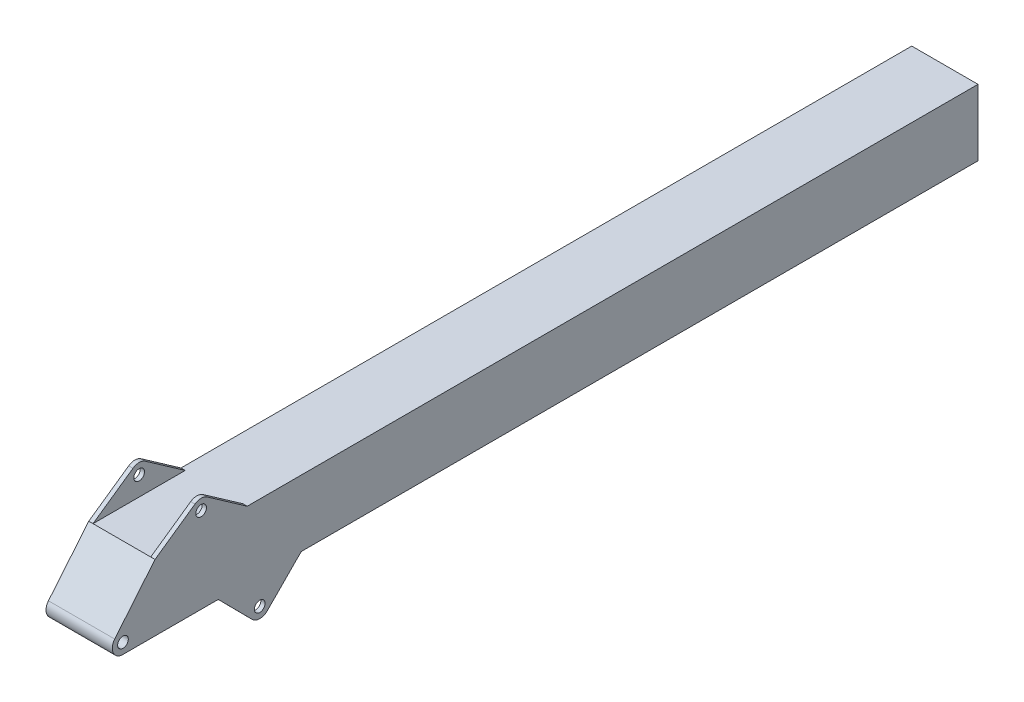
ISO-10303-21;
HEADER;
FILE_DESCRIPTION(('STEP AP214'),'2;1');
FILE_NAME('part.step','',(''),(''),'','','');
FILE_SCHEMA(('AUTOMOTIVE_DESIGN { 1 0 10303 214 1 1 1 1 }'));
ENDSEC;
DATA;
#1=APPLICATION_CONTEXT('core data for automotive mechanical design processes');
#2=APPLICATION_PROTOCOL_DEFINITION('international standard','automotive_design',2000,#1);
#3=PRODUCT_CONTEXT('',#1,'mechanical');
#4=PRODUCT('Part','Part','',(#3));
#5=PRODUCT_RELATED_PRODUCT_CATEGORY('part','',(#4));
#6=PRODUCT_DEFINITION_FORMATION('','',#4);
#7=PRODUCT_DEFINITION_CONTEXT('part definition',#1,'design');
#8=PRODUCT_DEFINITION('design','',#6,#7);
#9=PRODUCT_DEFINITION_SHAPE('','',#8);
#10=(LENGTH_UNIT() NAMED_UNIT(*) SI_UNIT(.MILLI.,.METRE.));
#11=(NAMED_UNIT(*) PLANE_ANGLE_UNIT() SI_UNIT($,.RADIAN.));
#12=(NAMED_UNIT(*) SI_UNIT($,.STERADIAN.) SOLID_ANGLE_UNIT());
#13=UNCERTAINTY_MEASURE_WITH_UNIT(LENGTH_MEASURE(1.E-05),#10,'distance_accuracy_value','');
#14=(GEOMETRIC_REPRESENTATION_CONTEXT(3) GLOBAL_UNCERTAINTY_ASSIGNED_CONTEXT((#13)) GLOBAL_UNIT_ASSIGNED_CONTEXT((#10,
#11,#12)) REPRESENTATION_CONTEXT('',''));
#15=CARTESIAN_POINT('',(0.,0.,0.));
#16=DIRECTION('',(0.,0.,1.));
#17=DIRECTION('',(1.,0.,0.));
#18=AXIS2_PLACEMENT_3D('',#15,#16,#17);
#19=CARTESIAN_POINT('',(-310.,310.,1850.));
#20=DIRECTION('',(0.,1.,0.));
#21=DIRECTION('',(0.,0.,1.));
#22=AXIS2_PLACEMENT_3D('',#19,#20,#21);
#23=PLANE('',#22);
#24=DIRECTION('',(-1.,0.,0.));
#25=VECTOR('',#24,1.);
#26=CARTESIAN_POINT('',(-290.,310.000000000001,1418.58867922431));
#27=LINE('',#26,#25);
#28=CARTESIAN_POINT('',(-290.,310.,1418.58867922431));
#29=VERTEX_POINT('',#28);
#30=CARTESIAN_POINT('',(-310.,310.,1418.58867922431));
#31=VERTEX_POINT('',#30);
#32=EDGE_CURVE('E53',#29,#31,#27,.T.);
#33=ORIENTED_EDGE('',*,*,#32,.F.);
#34=DIRECTION('',(0.,0.,-1.));
#35=VECTOR('',#34,1.);
#36=CARTESIAN_POINT('',(-290.,310.,1850.));
#37=LINE('',#36,#35);
#38=CARTESIAN_POINT('',(-290.,310.,1850.));
#39=VERTEX_POINT('',#38);
#40=EDGE_CURVE('E57',#39,#29,#37,.T.);
#41=ORIENTED_EDGE('',*,*,#40,.F.);
#42=DIRECTION('',(1.,0.,0.));
#43=VECTOR('',#42,1.);
#44=CARTESIAN_POINT('',(-310.,310.,1850.));
#45=LINE('',#44,#43);
#46=CARTESIAN_POINT('',(-20.,310.,1850.));
#47=VERTEX_POINT('',#46);
#48=EDGE_CURVE('E392',#39,#47,#45,.T.);
#49=ORIENTED_EDGE('',*,*,#48,.T.);
#50=DIRECTION('',(0.,0.,-1.));
#51=VECTOR('',#50,1.);
#52=CARTESIAN_POINT('',(-20.,310.,1850.));
#53=LINE('',#52,#51);
#54=CARTESIAN_POINT('',(-20.,310.000000000001,1418.58867922431));
#55=VERTEX_POINT('',#54);
#56=EDGE_CURVE('E278',#47,#55,#53,.T.);
#57=ORIENTED_EDGE('',*,*,#56,.T.);
#58=DIRECTION('',(1.,0.,0.));
#59=VECTOR('',#58,1.);
#60=CARTESIAN_POINT('',(-20.,310.000000000001,1418.58867922431));
#61=LINE('',#60,#59);
#62=CARTESIAN_POINT('',(0.,310.,1418.58867922431));
#63=VERTEX_POINT('',#62);
#64=EDGE_CURVE('E291',#55,#63,#61,.T.);
#65=ORIENTED_EDGE('',*,*,#64,.T.);
#66=DIRECTION('',(0.,0.,1.));
#67=VECTOR('',#66,1.);
#68=CARTESIAN_POINT('',(0.,310.,1850.));
#69=LINE('',#68,#67);
#70=CARTESIAN_POINT('',(0.,310.,-2000.));
#71=VERTEX_POINT('',#70);
#72=EDGE_CURVE('E374',#71,#63,#69,.T.);
#73=ORIENTED_EDGE('',*,*,#72,.F.);
#74=DIRECTION('',(1.,0.,0.));
#75=VECTOR('',#74,1.);
#76=CARTESIAN_POINT('',(-310.,310.,-2000.));
#77=LINE('',#76,#75);
#78=CARTESIAN_POINT('',(-310.,310.,-2000.));
#79=VERTEX_POINT('',#78);
#80=EDGE_CURVE('E11',#79,#71,#77,.T.);
#81=ORIENTED_EDGE('',*,*,#80,.F.);
#82=DIRECTION('',(0.,0.,1.));
#83=VECTOR('',#82,1.);
#84=CARTESIAN_POINT('',(-310.,310.,1850.));
#85=LINE('',#84,#83);
#86=EDGE_CURVE('E377',#79,#31,#85,.T.);
#87=ORIENTED_EDGE('',*,*,#86,.T.);
#88=EDGE_LOOP('',(#33,#41,#49,#57,#65,#73,#81,#87));
#89=FACE_BOUND('',#88,.T.);
#90=ADVANCED_FACE('F37',(#89),#23,.T.);
#91=CARTESIAN_POINT('',(-310.,4.19803081186387E-13,-2000.));
#92=DIRECTION('',(0.,-1.,0.));
#93=DIRECTION('',(0.,0.,-1.));
#94=AXIS2_PLACEMENT_3D('',#91,#92,#93);
#95=PLANE('',#94);
#96=DIRECTION('',(0.,0.,-1.));
#97=VECTOR('',#96,1.);
#98=CARTESIAN_POINT('',(-310.,4.19803081186387E-13,-2000.));
#99=LINE('',#98,#97);
#100=CARTESIAN_POINT('',(-310.,-3.15719672627779E-13,2000.));
#101=VERTEX_POINT('',#100);
#102=CARTESIAN_POINT('',(-310.,-2.33703163939663E-13,1553.96888396555));
#103=VERTEX_POINT('',#102);
#104=EDGE_CURVE('E387',#101,#103,#99,.T.);
#105=ORIENTED_EDGE('',*,*,#104,.T.);
#106=DIRECTION('',(-1.,0.,0.));
#107=VECTOR('',#106,1.);
#108=CARTESIAN_POINT('',(-290.,-2.66824240972082E-13,1553.96888396555));
#109=LINE('',#108,#107);
#110=CARTESIAN_POINT('',(-290.,-2.33703163939663E-13,1553.96888396555));
#111=VERTEX_POINT('',#110);
#112=EDGE_CURVE('E253',#111,#103,#109,.T.);
#113=ORIENTED_EDGE('',*,*,#112,.F.);
#114=DIRECTION('',(0.,0.,1.));
#115=VECTOR('',#114,1.);
#116=CARTESIAN_POINT('',(-290.,-2.66824240972082E-13,1553.96888396555));
#117=LINE('',#116,#115);
#118=CARTESIAN_POINT('',(-290.,-1.62368900095361E-13,1166.03111603445));
#119=VERTEX_POINT('',#118);
#120=EDGE_CURVE('E244',#119,#111,#117,.T.);
#121=ORIENTED_EDGE('',*,*,#120,.F.);
#122=DIRECTION('',(-1.,0.,0.));
#123=VECTOR('',#122,1.);
#124=CARTESIAN_POINT('',(-290.,-2.66824240972082E-13,1166.03111603445));
#125=LINE('',#124,#123);
#126=CARTESIAN_POINT('',(-310.,-2.66824240972082E-13,1166.03111603445));
#127=VERTEX_POINT('',#126);
#128=EDGE_CURVE('E267',#119,#127,#125,.T.);
#129=ORIENTED_EDGE('',*,*,#128,.T.);
#130=CARTESIAN_POINT('',(-310.,4.19803081186387E-13,-2000.));
#131=VERTEX_POINT('',#130);
#132=EDGE_CURVE('E386',#127,#131,#99,.T.);
#133=ORIENTED_EDGE('',*,*,#132,.T.);
#134=DIRECTION('',(1.,0.,0.));
#135=VECTOR('',#134,1.);
#136=CARTESIAN_POINT('',(-310.,4.19803081186387E-13,-2000.));
#137=LINE('',#136,#135);
#138=CARTESIAN_POINT('',(0.,4.19803081186387E-13,-2000.));
#139=VERTEX_POINT('',#138);
#140=EDGE_CURVE('E45',#131,#139,#137,.T.);
#141=ORIENTED_EDGE('',*,*,#140,.T.);
#142=DIRECTION('',(0.,0.,-1.));
#143=VECTOR('',#142,1.);
#144=CARTESIAN_POINT('',(0.,4.19803081186387E-13,-2000.));
#145=LINE('',#144,#143);
#146=CARTESIAN_POINT('',(0.,-1.62368900095361E-13,1166.03111603445));
#147=VERTEX_POINT('',#146);
#148=EDGE_CURVE('E401',#147,#139,#145,.T.);
#149=ORIENTED_EDGE('',*,*,#148,.F.);
#150=DIRECTION('',(1.,0.,0.));
#151=VECTOR('',#150,1.);
#152=CARTESIAN_POINT('',(-20.,-2.66824240972082E-13,1166.03111603445));
#153=LINE('',#152,#151);
#154=CARTESIAN_POINT('',(-20.,-2.66824240972082E-13,1166.03111603445));
#155=VERTEX_POINT('',#154);
#156=EDGE_CURVE('E337',#155,#147,#153,.T.);
#157=ORIENTED_EDGE('',*,*,#156,.F.);
#158=DIRECTION('',(0.,0.,1.));
#159=VECTOR('',#158,1.);
#160=CARTESIAN_POINT('',(-20.,-2.66824240972082E-13,1553.96888396555));
#161=LINE('',#160,#159);
#162=CARTESIAN_POINT('',(-20.,-2.66824240972082E-13,1553.96888396555));
#163=VERTEX_POINT('',#162);
#164=EDGE_CURVE('E323',#155,#163,#161,.T.);
#165=ORIENTED_EDGE('',*,*,#164,.T.);
#166=DIRECTION('',(1.,0.,0.));
#167=VECTOR('',#166,1.);
#168=CARTESIAN_POINT('',(-20.,-2.66824240972082E-13,1553.96888396555));
#169=LINE('',#168,#167);
#170=CARTESIAN_POINT('',(0.,-2.66824240972082E-13,1553.96888396555));
#171=VERTEX_POINT('',#170);
#172=EDGE_CURVE('E333',#163,#171,#169,.T.);
#173=ORIENTED_EDGE('',*,*,#172,.T.);
#174=CARTESIAN_POINT('',(0.,-3.15719672627779E-13,2000.));
#175=VERTEX_POINT('',#174);
#176=EDGE_CURVE('E402',#175,#171,#145,.T.);
#177=ORIENTED_EDGE('',*,*,#176,.F.);
#178=DIRECTION('',(1.,0.,0.));
#179=VECTOR('',#178,1.);
#180=CARTESIAN_POINT('',(-310.,-3.15719672627779E-13,2000.));
#181=LINE('',#180,#179);
#182=EDGE_CURVE('E409',#101,#175,#181,.T.);
#183=ORIENTED_EDGE('',*,*,#182,.F.);
#184=EDGE_LOOP('',(#105,#113,#121,#129,#133,#141,#149,#157,#165,#173,#177,#183));
#185=FACE_BOUND('',#184,.T.);
#186=ADVANCED_FACE('F458',(#185),#95,.T.);
#187=CARTESIAN_POINT('',(-310.,20.0000000000004,-2000.));
#188=DIRECTION('',(0.,-1.,0.));
#189=DIRECTION('',(0.,0.,-1.));
#190=AXIS2_PLACEMENT_3D('',#187,#188,#189);
#191=PLANE('',#190);
#192=DIRECTION('',(-1.,0.,0.));
#193=VECTOR('',#192,1.);
#194=CARTESIAN_POINT('',(-290.,20.0000000000004,1840.58238892007));
#195=LINE('',#194,#193);
#196=CARTESIAN_POINT('',(-20.,20.0000000000004,1840.58238892007));
#197=VERTEX_POINT('',#196);
#198=CARTESIAN_POINT('',(-290.,20.0000000000004,1840.58238892007));
#199=VERTEX_POINT('',#198);
#200=EDGE_CURVE('E343',#197,#199,#195,.T.);
#201=ORIENTED_EDGE('',*,*,#200,.F.);
#202=DIRECTION('',(0.,0.,-1.));
#203=VECTOR('',#202,1.);
#204=CARTESIAN_POINT('',(-20.,20.0000000000004,-2000.));
#205=LINE('',#204,#203);
#206=CARTESIAN_POINT('',(-20.,20.0000000000004,-2000.));
#207=VERTEX_POINT('',#206);
#208=EDGE_CURVE('E351',#197,#207,#205,.T.);
#209=ORIENTED_EDGE('',*,*,#208,.T.);
#210=DIRECTION('',(1.,0.,0.));
#211=VECTOR('',#210,1.);
#212=CARTESIAN_POINT('',(-310.,20.0000000000004,-2000.));
#213=LINE('',#212,#211);
#214=CARTESIAN_POINT('',(-290.,20.0000000000004,-2000.));
#215=VERTEX_POINT('',#214);
#216=EDGE_CURVE('E359',#215,#207,#213,.T.);
#217=ORIENTED_EDGE('',*,*,#216,.F.);
#218=DIRECTION('',(0.,0.,-1.));
#219=VECTOR('',#218,1.);
#220=CARTESIAN_POINT('',(-290.,20.0000000000004,-2000.));
#221=LINE('',#220,#219);
#222=EDGE_CURVE('E355',#199,#215,#221,.T.);
#223=ORIENTED_EDGE('',*,*,#222,.F.);
#224=EDGE_LOOP('',(#201,#209,#217,#223));
#225=FACE_BOUND('',#224,.T.);
#226=ADVANCED_FACE('F462',(#225),#191,.F.);
#227=CARTESIAN_POINT('',(-290.,49.9999999999999,2000.));
#228=DIRECTION('',(-1.,0.,0.));
#229=DIRECTION('',(0.,0.,1.));
#230=AXIS2_PLACEMENT_3D('',#227,#228,#229);
#231=PLANE('',#230);
#232=DIRECTION('',(0.,1.,0.));
#233=VECTOR('',#232,1.);
#234=CARTESIAN_POINT('',(-290.,20.0000000000004,1840.58238892007));
#235=LINE('',#234,#233);
#236=CARTESIAN_POINT('',(-290.,290.,1840.58238892007));
#237=VERTEX_POINT('',#236);
#238=EDGE_CURVE('E336',#199,#237,#235,.T.);
#239=ORIENTED_EDGE('',*,*,#238,.F.);
#240=ORIENTED_EDGE('',*,*,#222,.T.);
#241=DIRECTION('',(0.,1.,0.));
#242=VECTOR('',#241,1.);
#243=CARTESIAN_POINT('',(-290.,310.,-2000.));
#244=LINE('',#243,#242);
#245=CARTESIAN_POINT('',(-290.,290.,-2000.));
#246=VERTEX_POINT('',#245);
#247=EDGE_CURVE('E360',#215,#246,#244,.T.);
#248=ORIENTED_EDGE('',*,*,#247,.T.);
#249=DIRECTION('',(0.,0.,1.));
#250=VECTOR('',#249,1.);
#251=CARTESIAN_POINT('',(-290.,290.,1850.));
#252=LINE('',#251,#250);
#253=EDGE_CURVE('E352',#246,#237,#252,.T.);
#254=ORIENTED_EDGE('',*,*,#253,.T.);
#255=EDGE_LOOP('',(#239,#240,#248,#254));
#256=FACE_BOUND('',#255,.T.);
#257=ADVANCED_FACE('F468',(#256),#231,.F.);
#258=CARTESIAN_POINT('',(-20.,49.9999999999999,2000.));
#259=DIRECTION('',(-1.,0.,0.));
#260=DIRECTION('',(0.,0.,1.));
#261=AXIS2_PLACEMENT_3D('',#258,#259,#260);
#262=PLANE('',#261);
#263=ORIENTED_EDGE('',*,*,#208,.F.);
#264=DIRECTION('',(0.,-1.,0.));
#265=VECTOR('',#264,1.);
#266=CARTESIAN_POINT('',(-20.,20.0000000000004,1840.58238892007));
#267=LINE('',#266,#265);
#268=CARTESIAN_POINT('',(-20.,290.,1840.58238892007));
#269=VERTEX_POINT('',#268);
#270=EDGE_CURVE('E346',#269,#197,#267,.T.);
#271=ORIENTED_EDGE('',*,*,#270,.F.);
#272=DIRECTION('',(0.,0.,1.));
#273=VECTOR('',#272,1.);
#274=CARTESIAN_POINT('',(-20.,290.,1850.));
#275=LINE('',#274,#273);
#276=CARTESIAN_POINT('',(-20.,290.,-2000.));
#277=VERTEX_POINT('',#276);
#278=EDGE_CURVE('E345',#277,#269,#275,.T.);
#279=ORIENTED_EDGE('',*,*,#278,.F.);
#280=DIRECTION('',(0.,1.,0.));
#281=VECTOR('',#280,1.);
#282=CARTESIAN_POINT('',(-20.,310.,-2000.));
#283=LINE('',#282,#281);
#284=EDGE_CURVE('E356',#207,#277,#283,.T.);
#285=ORIENTED_EDGE('',*,*,#284,.F.);
#286=EDGE_LOOP('',(#263,#271,#279,#285));
#287=FACE_BOUND('',#286,.T.);
#288=ADVANCED_FACE('F493',(#287),#262,.T.);
#289=CARTESIAN_POINT('',(-310.,310.,-2000.));
#290=DIRECTION('',(0.,0.,-1.));
#291=DIRECTION('',(-1.,0.,0.));
#292=AXIS2_PLACEMENT_3D('',#289,#290,#291);
#293=PLANE('',#292);
#294=DIRECTION('',(0.,1.,0.));
#295=VECTOR('',#294,1.);
#296=CARTESIAN_POINT('',(0.,310.,-2000.));
#297=LINE('',#296,#295);
#298=EDGE_CURVE('E380',#139,#71,#297,.T.);
#299=ORIENTED_EDGE('',*,*,#298,.F.);
#300=ORIENTED_EDGE('',*,*,#140,.F.);
#301=DIRECTION('',(0.,1.,0.));
#302=VECTOR('',#301,1.);
#303=CARTESIAN_POINT('',(-310.,310.,-2000.));
#304=LINE('',#303,#302);
#305=EDGE_CURVE('E389',#131,#79,#304,.T.);
#306=ORIENTED_EDGE('',*,*,#305,.T.);
#307=ORIENTED_EDGE('',*,*,#80,.T.);
#308=EDGE_LOOP('',(#299,#300,#306,#307));
#309=FACE_BOUND('',#308,.T.);
#310=ORIENTED_EDGE('',*,*,#216,.T.);
#311=ORIENTED_EDGE('',*,*,#284,.T.);
#312=DIRECTION('',(1.,0.,0.));
#313=VECTOR('',#312,1.);
#314=CARTESIAN_POINT('',(-310.,290.,-2000.));
#315=LINE('',#314,#313);
#316=EDGE_CURVE('E363',#246,#277,#315,.T.);
#317=ORIENTED_EDGE('',*,*,#316,.F.);
#318=ORIENTED_EDGE('',*,*,#247,.F.);
#319=EDGE_LOOP('',(#310,#311,#317,#318));
#320=FACE_BOUND('',#319,.T.);
#321=ADVANCED_FACE('F438',(#309,#320),#293,.T.);
#322=CARTESIAN_POINT('',(-310.,49.9999999999999,2000.));
#323=DIRECTION('',(1.,0.,0.));
#324=DIRECTION('',(0.,0.,-1.));
#325=AXIS2_PLACEMENT_3D('',#322,#323,#324);
#326=CYLINDRICAL_SURFACE('',#325,50.0000000000001);
#327=CARTESIAN_POINT('',(0.,49.9999999999999,2000.));
#328=DIRECTION('',(1.,0.,0.));
#329=DIRECTION('',(0.,0.,1.));
#330=AXIS2_PLACEMENT_3D('',#327,#328,#329);
#331=CIRCLE('',#330,50.0000000000001);
#332=CARTESIAN_POINT('',(0.,81.851246260181,2038.54216018431));
#333=VERTEX_POINT('',#332);
#334=EDGE_CURVE('E398',#333,#175,#331,.T.);
#335=ORIENTED_EDGE('',*,*,#334,.F.);
#336=DIRECTION('',(1.,0.,0.));
#337=VECTOR('',#336,1.);
#338=CARTESIAN_POINT('',(-310.,81.851246260181,2038.54216018431));
#339=LINE('',#338,#337);
#340=CARTESIAN_POINT('',(-310.,81.851246260181,2038.54216018431));
#341=VERTEX_POINT('',#340);
#342=EDGE_CURVE('E410',#341,#333,#339,.T.);
#343=ORIENTED_EDGE('',*,*,#342,.F.);
#344=CARTESIAN_POINT('',(-310.,49.9999999999999,2000.));
#345=DIRECTION('',(1.,0.,0.));
#346=DIRECTION('',(0.,0.,1.));
#347=AXIS2_PLACEMENT_3D('',#344,#345,#346);
#348=CIRCLE('',#347,50.0000000000001);
#349=EDGE_CURVE('E383',#341,#101,#348,.T.);
#350=ORIENTED_EDGE('',*,*,#349,.T.);
#351=ORIENTED_EDGE('',*,*,#182,.T.);
#352=EDGE_LOOP('',(#335,#343,#350,#351));
#353=FACE_BOUND('',#352,.T.);
#354=ADVANCED_FACE('F474',(#353),#326,.T.);
#355=CARTESIAN_POINT('',(-310.,81.8512462601809,2038.54216018431));
#356=DIRECTION('',(0.,0.63702492520362,0.770843203686277));
#357=DIRECTION('',(0.,-0.770843203686277,0.63702492520362));
#358=AXIS2_PLACEMENT_3D('',#355,#356,#357);
#359=PLANE('',#358);
#360=DIRECTION('',(0.,-0.770843203686277,0.63702492520362));
#361=VECTOR('',#360,1.);
#362=CARTESIAN_POINT('',(0.,81.8512462601809,2038.54216018431));
#363=LINE('',#362,#361);
#364=CARTESIAN_POINT('',(0.,310.,1850.));
#365=VERTEX_POINT('',#364);
#366=EDGE_CURVE('E395',#365,#333,#363,.T.);
#367=ORIENTED_EDGE('',*,*,#366,.F.);
#368=DIRECTION('',(1.,0.,0.));
#369=VECTOR('',#368,1.);
#370=CARTESIAN_POINT('',(-20.,310.,1850.));
#371=LINE('',#370,#369);
#372=EDGE_CURVE('E299',#47,#365,#371,.T.);
#373=ORIENTED_EDGE('',*,*,#372,.F.);
#374=ORIENTED_EDGE('',*,*,#48,.F.);
#375=CARTESIAN_POINT('',(-310.,310.,1850.));
#376=VERTEX_POINT('',#375);
#377=EDGE_CURVE('E40',#376,#39,#45,.T.);
#378=ORIENTED_EDGE('',*,*,#377,.F.);
#379=DIRECTION('',(0.,-0.770843203686277,0.63702492520362));
#380=VECTOR('',#379,1.);
#381=CARTESIAN_POINT('',(-310.,81.8512462601809,2038.54216018431));
#382=LINE('',#381,#380);
#383=EDGE_CURVE('E379',#376,#341,#382,.T.);
#384=ORIENTED_EDGE('',*,*,#383,.T.);
#385=ORIENTED_EDGE('',*,*,#342,.T.);
#386=EDGE_LOOP('',(#367,#373,#374,#378,#384,#385));
#387=FACE_BOUND('',#386,.T.);
#388=ADVANCED_FACE('F424',(#387),#359,.T.);
#389=CARTESIAN_POINT('',(-310.,49.9999999999999,2000.));
#390=DIRECTION('',(-1.,0.,0.));
#391=DIRECTION('',(0.,0.,1.));
#392=AXIS2_PLACEMENT_3D('',#389,#390,#391);
#393=PLANE('',#392);
#394=CARTESIAN_POINT('',(-310.,49.9999999999999,2000.));
#395=DIRECTION('',(1.,0.,0.));
#396=DIRECTION('',(0.,0.,-1.));
#397=AXIS2_PLACEMENT_3D('',#394,#395,#396);
#398=CIRCLE('',#397,25.);
#399=CARTESIAN_POINT('',(-310.,49.9999999999999,1975.));
#400=VERTEX_POINT('',#399);
#401=EDGE_CURVE('E371',#400,#400,#398,.T.);
#402=ORIENTED_EDGE('',*,*,#401,.T.);
#403=EDGE_LOOP('',(#402));
#404=FACE_BOUND('',#403,.T.);
#405=ORIENTED_EDGE('',*,*,#86,.F.);
#406=ORIENTED_EDGE('',*,*,#305,.F.);
#407=ORIENTED_EDGE('',*,*,#132,.F.);
#408=DIRECTION('',(0.,0.710959807943813,-0.7032326439298));
#409=VECTOR('',#408,1.);
#410=CARTESIAN_POINT('',(-310.,-2.66824240972082E-13,1166.03111603445));
#411=LINE('',#410,#409);
#412=CARTESIAN_POINT('',(-310.,-160.16163219649,1324.45200960281));
#413=VERTEX_POINT('',#412);
#414=EDGE_CURVE('E256',#413,#127,#411,.T.);
#415=ORIENTED_EDGE('',*,*,#414,.F.);
#416=CARTESIAN_POINT('',(-310.,-125.,1360.));
#417=DIRECTION('',(1.,0.,0.));
#418=DIRECTION('',(0.,0.,1.));
#419=AXIS2_PLACEMENT_3D('',#416,#417,#418);
#420=CIRCLE('',#419,50.0000000000001);
#421=CARTESIAN_POINT('',(-310.,-160.16163219649,1395.54799039719));
#422=VERTEX_POINT('',#421);
#423=EDGE_CURVE('E245',#422,#413,#420,.T.);
#424=ORIENTED_EDGE('',*,*,#423,.F.);
#425=DIRECTION('',(0.,-0.710959807943813,-0.7032326439298));
#426=VECTOR('',#425,1.);
#427=CARTESIAN_POINT('',(-310.,-160.161632196491,1395.54799039719));
#428=LINE('',#427,#426);
#429=EDGE_CURVE('E238',#103,#422,#428,.T.);
#430=ORIENTED_EDGE('',*,*,#429,.F.);
#431=ORIENTED_EDGE('',*,*,#104,.F.);
#432=ORIENTED_EDGE('',*,*,#349,.F.);
#433=ORIENTED_EDGE('',*,*,#383,.F.);
#434=DIRECTION('',(0.,-0.573576436351046,0.819152044288991));
#435=VECTOR('',#434,1.);
#436=CARTESIAN_POINT('',(-310.,310.,1850.));
#437=LINE('',#436,#435);
#438=CARTESIAN_POINT('',(-310.,440.95760221445,1662.97316142971));
#439=VERTEX_POINT('',#438);
#440=EDGE_CURVE('E227',#439,#376,#437,.T.);
#441=ORIENTED_EDGE('',*,*,#440,.F.);
#442=CARTESIAN_POINT('',(-310.,400.,1634.29433961216));
#443=DIRECTION('',(1.,0.,0.));
#444=DIRECTION('',(0.,0.,-1.));
#445=AXIS2_PLACEMENT_3D('',#442,#443,#444);
#446=CIRCLE('',#445,50.);
#447=CARTESIAN_POINT('',(-310.,440.95760221445,1605.6155177946));
#448=VERTEX_POINT('',#447);
#449=EDGE_CURVE('E213',#448,#439,#446,.T.);
#450=ORIENTED_EDGE('',*,*,#449,.F.);
#451=DIRECTION('',(0.,0.573576436351047,0.819152044288991));
#452=VECTOR('',#451,1.);
#453=CARTESIAN_POINT('',(-310.,440.95760221445,1605.6155177946));
#454=LINE('',#453,#452);
#455=EDGE_CURVE('E222',#31,#448,#454,.T.);
#456=ORIENTED_EDGE('',*,*,#455,.F.);
#457=EDGE_LOOP('',(#405,#406,#407,#415,#424,#430,#431,#432,#433,#441,#450,#456));
#458=FACE_BOUND('',#457,.T.);
#459=CARTESIAN_POINT('',(-310.,-125.,1360.));
#460=DIRECTION('',(1.,0.,0.));
#461=DIRECTION('',(0.,0.,-1.));
#462=AXIS2_PLACEMENT_3D('',#459,#460,#461);
#463=CIRCLE('',#462,25.);
#464=CARTESIAN_POINT('',(-310.,-125.,1335.));
#465=VERTEX_POINT('',#464);
#466=EDGE_CURVE('E233',#465,#465,#463,.T.);
#467=ORIENTED_EDGE('',*,*,#466,.T.);
#468=EDGE_LOOP('',(#467));
#469=FACE_BOUND('',#468,.T.);
#470=CARTESIAN_POINT('',(-310.,400.,1634.29433961216));
#471=DIRECTION('',(1.,0.,0.));
#472=DIRECTION('',(0.,0.,-1.));
#473=AXIS2_PLACEMENT_3D('',#470,#471,#472);
#474=CIRCLE('',#473,25.);
#475=CARTESIAN_POINT('',(-310.,400.,1609.29433961216));
#476=VERTEX_POINT('',#475);
#477=EDGE_CURVE('E573',#476,#476,#474,.T.);
#478=ORIENTED_EDGE('',*,*,#477,.T.);
#479=EDGE_LOOP('',(#478));
#480=FACE_BOUND('',#479,.T.);
#481=ADVANCED_FACE('F444',(#404,#458,#469,#480),#393,.T.);
#482=CARTESIAN_POINT('',(0.,49.9999999999999,2000.));
#483=DIRECTION('',(-1.,0.,0.));
#484=DIRECTION('',(0.,0.,1.));
#485=AXIS2_PLACEMENT_3D('',#482,#483,#484);
#486=PLANE('',#485);
#487=CARTESIAN_POINT('',(0.,49.9999999999999,2000.));
#488=DIRECTION('',(1.,0.,0.));
#489=DIRECTION('',(0.,0.,-1.));
#490=AXIS2_PLACEMENT_3D('',#487,#488,#489);
#491=CIRCLE('',#490,25.);
#492=CARTESIAN_POINT('',(0.,49.9999999999999,1975.));
#493=VERTEX_POINT('',#492);
#494=EDGE_CURVE('E365',#493,#493,#491,.T.);
#495=ORIENTED_EDGE('',*,*,#494,.F.);
#496=EDGE_LOOP('',(#495));
#497=FACE_BOUND('',#496,.T.);
#498=ORIENTED_EDGE('',*,*,#72,.T.);
#499=DIRECTION('',(0.,0.573576436351047,0.819152044288991));
#500=VECTOR('',#499,1.);
#501=CARTESIAN_POINT('',(0.,440.95760221445,1605.6155177946));
#502=LINE('',#501,#500);
#503=CARTESIAN_POINT('',(0.,440.95760221445,1605.6155177946));
#504=VERTEX_POINT('',#503);
#505=EDGE_CURVE('E275',#63,#504,#502,.T.);
#506=ORIENTED_EDGE('',*,*,#505,.T.);
#507=CARTESIAN_POINT('',(0.,400.,1634.29433961216));
#508=DIRECTION('',(1.,0.,0.));
#509=DIRECTION('',(0.,0.,-1.));
#510=AXIS2_PLACEMENT_3D('',#507,#508,#509);
#511=CIRCLE('',#510,50.);
#512=CARTESIAN_POINT('',(0.,440.95760221445,1662.97316142971));
#513=VERTEX_POINT('',#512);
#514=EDGE_CURVE('E294',#504,#513,#511,.T.);
#515=ORIENTED_EDGE('',*,*,#514,.T.);
#516=DIRECTION('',(0.,-0.573576436351046,0.819152044288991));
#517=VECTOR('',#516,1.);
#518=CARTESIAN_POINT('',(0.,310.,1850.));
#519=LINE('',#518,#517);
#520=EDGE_CURVE('E282',#513,#365,#519,.T.);
#521=ORIENTED_EDGE('',*,*,#520,.T.);
#522=ORIENTED_EDGE('',*,*,#366,.T.);
#523=ORIENTED_EDGE('',*,*,#334,.T.);
#524=ORIENTED_EDGE('',*,*,#176,.T.);
#525=DIRECTION('',(0.,-0.710959807943813,-0.7032326439298));
#526=VECTOR('',#525,1.);
#527=CARTESIAN_POINT('',(0.,-160.161632196491,1395.54799039719));
#528=LINE('',#527,#526);
#529=CARTESIAN_POINT('',(0.,-160.16163219649,1395.54799039719));
#530=VERTEX_POINT('',#529);
#531=EDGE_CURVE('E311',#171,#530,#528,.T.);
#532=ORIENTED_EDGE('',*,*,#531,.T.);
#533=CARTESIAN_POINT('',(0.,-125.,1360.));
#534=DIRECTION('',(1.,0.,0.));
#535=DIRECTION('',(0.,0.,1.));
#536=AXIS2_PLACEMENT_3D('',#533,#534,#535);
#537=CIRCLE('',#536,50.0000000000001);
#538=CARTESIAN_POINT('',(0.,-160.16163219649,1324.45200960281));
#539=VERTEX_POINT('',#538);
#540=EDGE_CURVE('E329',#530,#539,#537,.T.);
#541=ORIENTED_EDGE('',*,*,#540,.T.);
#542=DIRECTION('',(0.,0.710959807943813,-0.7032326439298));
#543=VECTOR('',#542,1.);
#544=CARTESIAN_POINT('',(0.,-2.66824240972082E-13,1166.03111603445));
#545=LINE('',#544,#543);
#546=EDGE_CURVE('E318',#539,#147,#545,.T.);
#547=ORIENTED_EDGE('',*,*,#546,.T.);
#548=ORIENTED_EDGE('',*,*,#148,.T.);
#549=ORIENTED_EDGE('',*,*,#298,.T.);
#550=EDGE_LOOP('',(#498,#506,#515,#521,#522,#523,#524,#532,#541,#547,#548,#549));
#551=FACE_BOUND('',#550,.T.);
#552=CARTESIAN_POINT('',(0.,-125.,1360.));
#553=DIRECTION('',(1.,0.,0.));
#554=DIRECTION('',(0.,0.,-1.));
#555=AXIS2_PLACEMENT_3D('',#552,#553,#554);
#556=CIRCLE('',#555,25.);
#557=CARTESIAN_POINT('',(0.,-125.,1335.));
#558=VERTEX_POINT('',#557);
#559=EDGE_CURVE('E301',#558,#558,#556,.T.);
#560=ORIENTED_EDGE('',*,*,#559,.F.);
#561=EDGE_LOOP('',(#560));
#562=FACE_BOUND('',#561,.T.);
#563=CARTESIAN_POINT('',(0.,400.,1634.29433961216));
#564=DIRECTION('',(1.,0.,0.));
#565=DIRECTION('',(0.,0.,-1.));
#566=AXIS2_PLACEMENT_3D('',#563,#564,#565);
#567=CIRCLE('',#566,25.);
#568=CARTESIAN_POINT('',(0.,400.,1609.29433961216));
#569=VERTEX_POINT('',#568);
#570=EDGE_CURVE('E263',#569,#569,#567,.T.);
#571=ORIENTED_EDGE('',*,*,#570,.F.);
#572=EDGE_LOOP('',(#571));
#573=FACE_BOUND('',#572,.T.);
#574=ADVANCED_FACE('F426',(#497,#551,#562,#573),#486,.F.);
#575=CARTESIAN_POINT('',(-310.,49.9999999999999,2000.));
#576=DIRECTION('',(1.,0.,0.));
#577=DIRECTION('',(0.,0.,-1.));
#578=AXIS2_PLACEMENT_3D('',#575,#576,#577);
#579=CYLINDRICAL_SURFACE('',#578,25.);
#580=ORIENTED_EDGE('',*,*,#401,.F.);
#581=EDGE_LOOP('',(#580));
#582=FACE_BOUND('',#581,.T.);
#583=ORIENTED_EDGE('',*,*,#494,.T.);
#584=EDGE_LOOP('',(#583));
#585=FACE_BOUND('',#584,.T.);
#586=ADVANCED_FACE('F486',(#582,#585),#579,.F.);
#587=CARTESIAN_POINT('',(-310.,290.,1850.));
#588=DIRECTION('',(0.,1.,0.));
#589=DIRECTION('',(0.,0.,1.));
#590=AXIS2_PLACEMENT_3D('',#587,#588,#589);
#591=PLANE('',#590);
#592=ORIENTED_EDGE('',*,*,#278,.T.);
#593=DIRECTION('',(1.,0.,0.));
#594=VECTOR('',#593,1.);
#595=CARTESIAN_POINT('',(-310.,290.,1840.58238892007));
#596=LINE('',#595,#594);
#597=EDGE_CURVE('E357',#237,#269,#596,.T.);
#598=ORIENTED_EDGE('',*,*,#597,.F.);
#599=ORIENTED_EDGE('',*,*,#253,.F.);
#600=ORIENTED_EDGE('',*,*,#316,.T.);
#601=EDGE_LOOP('',(#592,#598,#599,#600));
#602=FACE_BOUND('',#601,.T.);
#603=ADVANCED_FACE('F491',(#602),#591,.F.);
#604=CARTESIAN_POINT('',(0.,0.,1840.58238892007));
#605=DIRECTION('',(0.,0.,1.));
#606=DIRECTION('',(1.,0.,0.));
#607=AXIS2_PLACEMENT_3D('',#604,#605,#606);
#608=PLANE('',#607);
#609=ORIENTED_EDGE('',*,*,#200,.T.);
#610=ORIENTED_EDGE('',*,*,#238,.T.);
#611=ORIENTED_EDGE('',*,*,#597,.T.);
#612=ORIENTED_EDGE('',*,*,#270,.T.);
#613=EDGE_LOOP('',(#609,#610,#611,#612));
#614=FACE_BOUND('',#613,.T.);
#615=ADVANCED_FACE('F502',(#614),#608,.F.);
#616=CARTESIAN_POINT('',(-20.,-160.161632196491,1395.54799039719));
#617=DIRECTION('',(0.,-0.7032326439298,0.710959807943813));
#618=DIRECTION('',(0.,-0.710959807943813,-0.7032326439298));
#619=AXIS2_PLACEMENT_3D('',#616,#617,#618);
#620=PLANE('',#619);
#621=ORIENTED_EDGE('',*,*,#531,.F.);
#622=ORIENTED_EDGE('',*,*,#172,.F.);
#623=DIRECTION('',(0.,-0.710959807943813,-0.7032326439298));
#624=VECTOR('',#623,1.);
#625=CARTESIAN_POINT('',(-20.,-160.161632196491,1395.54799039719));
#626=LINE('',#625,#624);
#627=CARTESIAN_POINT('',(-20.,-160.16163219649,1395.54799039719));
#628=VERTEX_POINT('',#627);
#629=EDGE_CURVE('E314',#163,#628,#626,.T.);
#630=ORIENTED_EDGE('',*,*,#629,.T.);
#631=DIRECTION('',(1.,0.,0.));
#632=VECTOR('',#631,1.);
#633=CARTESIAN_POINT('',(-20.,-160.16163219649,1395.54799039719));
#634=LINE('',#633,#632);
#635=EDGE_CURVE('E326',#628,#530,#634,.T.);
#636=ORIENTED_EDGE('',*,*,#635,.T.);
#637=EDGE_LOOP('',(#621,#622,#630,#636));
#638=FACE_BOUND('',#637,.T.);
#639=ADVANCED_FACE('F506',(#638),#620,.T.);
#640=CARTESIAN_POINT('',(-20.,-2.66824240972082E-13,1166.03111603445));
#641=DIRECTION('',(0.,-0.7032326439298,-0.710959807943813));
#642=DIRECTION('',(0.,0.710959807943813,-0.7032326439298));
#643=AXIS2_PLACEMENT_3D('',#640,#641,#642);
#644=PLANE('',#643);
#645=ORIENTED_EDGE('',*,*,#546,.F.);
#646=DIRECTION('',(1.,0.,0.));
#647=VECTOR('',#646,1.);
#648=CARTESIAN_POINT('',(-20.,-160.16163219649,1324.45200960281));
#649=LINE('',#648,#647);
#650=CARTESIAN_POINT('',(-20.,-160.16163219649,1324.45200960281));
#651=VERTEX_POINT('',#650);
#652=EDGE_CURVE('E340',#651,#539,#649,.T.);
#653=ORIENTED_EDGE('',*,*,#652,.F.);
#654=DIRECTION('',(0.,0.710959807943813,-0.7032326439298));
#655=VECTOR('',#654,1.);
#656=CARTESIAN_POINT('',(-20.,-2.66824240972082E-13,1166.03111603445));
#657=LINE('',#656,#655);
#658=EDGE_CURVE('E321',#651,#155,#657,.T.);
#659=ORIENTED_EDGE('',*,*,#658,.T.);
#660=ORIENTED_EDGE('',*,*,#156,.T.);
#661=EDGE_LOOP('',(#645,#653,#659,#660));
#662=FACE_BOUND('',#661,.T.);
#663=ADVANCED_FACE('F510',(#662),#644,.T.);
#664=CARTESIAN_POINT('',(-20.,-125.,1360.));
#665=DIRECTION('',(1.,0.,0.));
#666=DIRECTION('',(0.,0.,-1.));
#667=AXIS2_PLACEMENT_3D('',#664,#665,#666);
#668=CYLINDRICAL_SURFACE('',#667,50.0000000000001);
#669=ORIENTED_EDGE('',*,*,#540,.F.);
#670=ORIENTED_EDGE('',*,*,#635,.F.);
#671=CARTESIAN_POINT('',(-20.,-125.,1360.));
#672=DIRECTION('',(1.,0.,0.));
#673=DIRECTION('',(0.,0.,1.));
#674=AXIS2_PLACEMENT_3D('',#671,#672,#673);
#675=CIRCLE('',#674,50.0000000000001);
#676=EDGE_CURVE('E317',#628,#651,#675,.T.);
#677=ORIENTED_EDGE('',*,*,#676,.T.);
#678=ORIENTED_EDGE('',*,*,#652,.T.);
#679=EDGE_LOOP('',(#669,#670,#677,#678));
#680=FACE_BOUND('',#679,.T.);
#681=ADVANCED_FACE('F512',(#680),#668,.T.);
#682=CARTESIAN_POINT('',(-20.,-125.,1360.));
#683=DIRECTION('',(-1.,0.,0.));
#684=DIRECTION('',(0.,0.,1.));
#685=AXIS2_PLACEMENT_3D('',#682,#683,#684);
#686=PLANE('',#685);
#687=CARTESIAN_POINT('',(-20.,-125.,1360.));
#688=DIRECTION('',(1.,0.,0.));
#689=DIRECTION('',(0.,0.,-1.));
#690=AXIS2_PLACEMENT_3D('',#687,#688,#689);
#691=CIRCLE('',#690,25.);
#692=CARTESIAN_POINT('',(-20.,-125.,1335.));
#693=VERTEX_POINT('',#692);
#694=EDGE_CURVE('E308',#693,#693,#691,.T.);
#695=ORIENTED_EDGE('',*,*,#694,.T.);
#696=EDGE_LOOP('',(#695));
#697=FACE_BOUND('',#696,.T.);
#698=ORIENTED_EDGE('',*,*,#629,.F.);
#699=ORIENTED_EDGE('',*,*,#164,.F.);
#700=ORIENTED_EDGE('',*,*,#658,.F.);
#701=ORIENTED_EDGE('',*,*,#676,.F.);
#702=EDGE_LOOP('',(#698,#699,#700,#701));
#703=FACE_BOUND('',#702,.T.);
#704=ADVANCED_FACE('F515',(#697,#703),#686,.T.);
#705=CARTESIAN_POINT('',(-20.,-125.,1360.));
#706=DIRECTION('',(1.,0.,0.));
#707=DIRECTION('',(0.,0.,-1.));
#708=AXIS2_PLACEMENT_3D('',#705,#706,#707);
#709=CYLINDRICAL_SURFACE('',#708,25.);
#710=ORIENTED_EDGE('',*,*,#694,.F.);
#711=EDGE_LOOP('',(#710));
#712=FACE_BOUND('',#711,.T.);
#713=ORIENTED_EDGE('',*,*,#559,.T.);
#714=EDGE_LOOP('',(#713));
#715=FACE_BOUND('',#714,.T.);
#716=ADVANCED_FACE('F522',(#712,#715),#709,.F.);
#717=CARTESIAN_POINT('',(-20.,310.,1850.));
#718=DIRECTION('',(0.,0.819152044288991,0.573576436351046));
#719=DIRECTION('',(0.,-0.573576436351046,0.819152044288991));
#720=AXIS2_PLACEMENT_3D('',#717,#718,#719);
#721=PLANE('',#720);
#722=ORIENTED_EDGE('',*,*,#520,.F.);
#723=DIRECTION('',(1.,0.,0.));
#724=VECTOR('',#723,1.);
#725=CARTESIAN_POINT('',(-20.,440.95760221445,1662.97316142971));
#726=LINE('',#725,#724);
#727=CARTESIAN_POINT('',(-20.,440.95760221445,1662.97316142971));
#728=VERTEX_POINT('',#727);
#729=EDGE_CURVE('E302',#728,#513,#726,.T.);
#730=ORIENTED_EDGE('',*,*,#729,.F.);
#731=DIRECTION('',(0.,-0.573576436351046,0.819152044288991));
#732=VECTOR('',#731,1.);
#733=CARTESIAN_POINT('',(-20.,310.,1850.));
#734=LINE('',#733,#732);
#735=EDGE_CURVE('E288',#728,#47,#734,.T.);
#736=ORIENTED_EDGE('',*,*,#735,.T.);
#737=ORIENTED_EDGE('',*,*,#372,.T.);
#738=EDGE_LOOP('',(#722,#730,#736,#737));
#739=FACE_BOUND('',#738,.T.);
#740=ADVANCED_FACE('F423',(#739),#721,.T.);
#741=CARTESIAN_POINT('',(-20.,400.,1634.29433961216));
#742=DIRECTION('',(1.,0.,0.));
#743=DIRECTION('',(0.,0.,-1.));
#744=AXIS2_PLACEMENT_3D('',#741,#742,#743);
#745=CYLINDRICAL_SURFACE('',#744,50.);
#746=ORIENTED_EDGE('',*,*,#514,.F.);
#747=DIRECTION('',(1.,0.,0.));
#748=VECTOR('',#747,1.);
#749=CARTESIAN_POINT('',(-20.,440.95760221445,1605.6155177946));
#750=LINE('',#749,#748);
#751=CARTESIAN_POINT('',(-20.,440.95760221445,1605.6155177946));
#752=VERTEX_POINT('',#751);
#753=EDGE_CURVE('E304',#752,#504,#750,.T.);
#754=ORIENTED_EDGE('',*,*,#753,.F.);
#755=CARTESIAN_POINT('',(-20.,400.,1634.29433961216));
#756=DIRECTION('',(1.,0.,0.));
#757=DIRECTION('',(0.,0.,-1.));
#758=AXIS2_PLACEMENT_3D('',#755,#756,#757);
#759=CIRCLE('',#758,50.);
#760=EDGE_CURVE('E285',#752,#728,#759,.T.);
#761=ORIENTED_EDGE('',*,*,#760,.T.);
#762=ORIENTED_EDGE('',*,*,#729,.T.);
#763=EDGE_LOOP('',(#746,#754,#761,#762));
#764=FACE_BOUND('',#763,.T.);
#765=ADVANCED_FACE('F430',(#764),#745,.T.);
#766=CARTESIAN_POINT('',(-20.,440.95760221445,1605.6155177946));
#767=DIRECTION('',(0.,0.819152044288991,-0.573576436351047));
#768=DIRECTION('',(0.,0.573576436351047,0.819152044288991));
#769=AXIS2_PLACEMENT_3D('',#766,#767,#768);
#770=PLANE('',#769);
#771=ORIENTED_EDGE('',*,*,#505,.F.);
#772=ORIENTED_EDGE('',*,*,#64,.F.);
#773=DIRECTION('',(0.,0.573576436351047,0.819152044288991));
#774=VECTOR('',#773,1.);
#775=CARTESIAN_POINT('',(-20.,440.95760221445,1605.6155177946));
#776=LINE('',#775,#774);
#777=EDGE_CURVE('E281',#55,#752,#776,.T.);
#778=ORIENTED_EDGE('',*,*,#777,.T.);
#779=ORIENTED_EDGE('',*,*,#753,.T.);
#780=EDGE_LOOP('',(#771,#772,#778,#779));
#781=FACE_BOUND('',#780,.T.);
#782=ADVANCED_FACE('F432',(#781),#770,.T.);
#783=CARTESIAN_POINT('',(-20.,400.,1634.29433961216));
#784=DIRECTION('',(1.,0.,0.));
#785=DIRECTION('',(0.,0.,-1.));
#786=AXIS2_PLACEMENT_3D('',#783,#784,#785);
#787=PLANE('',#786);
#788=CARTESIAN_POINT('',(-20.,400.,1634.29433961216));
#789=DIRECTION('',(1.,0.,0.));
#790=DIRECTION('',(0.,0.,-1.));
#791=AXIS2_PLACEMENT_3D('',#788,#789,#790);
#792=CIRCLE('',#791,25.);
#793=CARTESIAN_POINT('',(-20.,400.,1609.29433961216));
#794=VERTEX_POINT('',#793);
#795=EDGE_CURVE('E272',#794,#794,#792,.T.);
#796=ORIENTED_EDGE('',*,*,#795,.T.);
#797=EDGE_LOOP('',(#796));
#798=FACE_BOUND('',#797,.T.);
#799=ORIENTED_EDGE('',*,*,#56,.F.);
#800=ORIENTED_EDGE('',*,*,#735,.F.);
#801=ORIENTED_EDGE('',*,*,#760,.F.);
#802=ORIENTED_EDGE('',*,*,#777,.F.);
#803=EDGE_LOOP('',(#799,#800,#801,#802));
#804=FACE_BOUND('',#803,.T.);
#805=ADVANCED_FACE('F419',(#798,#804),#787,.F.);
#806=CARTESIAN_POINT('',(-20.,400.,1634.29433961216));
#807=DIRECTION('',(1.,0.,0.));
#808=DIRECTION('',(0.,0.,-1.));
#809=AXIS2_PLACEMENT_3D('',#806,#807,#808);
#810=CYLINDRICAL_SURFACE('',#809,25.);
#811=ORIENTED_EDGE('',*,*,#795,.F.);
#812=EDGE_LOOP('',(#811));
#813=FACE_BOUND('',#812,.T.);
#814=ORIENTED_EDGE('',*,*,#570,.T.);
#815=EDGE_LOOP('',(#814));
#816=FACE_BOUND('',#815,.T.);
#817=ADVANCED_FACE('F535',(#813,#816),#810,.F.);
#818=CARTESIAN_POINT('',(-290.,-125.,1360.));
#819=DIRECTION('',(1.,0.,0.));
#820=DIRECTION('',(0.,0.,1.));
#821=AXIS2_PLACEMENT_3D('',#818,#819,#820);
#822=PLANE('',#821);
#823=DIRECTION('',(0.,-0.710959807943813,-0.7032326439298));
#824=VECTOR('',#823,1.);
#825=CARTESIAN_POINT('',(-290.,-160.161632196491,1395.54799039719));
#826=LINE('',#825,#824);
#827=CARTESIAN_POINT('',(-290.,-160.16163219649,1395.54799039719));
#828=VERTEX_POINT('',#827);
#829=EDGE_CURVE('E241',#111,#828,#826,.T.);
#830=ORIENTED_EDGE('',*,*,#829,.T.);
#831=CARTESIAN_POINT('',(-290.,-125.,1360.));
#832=DIRECTION('',(1.,0.,0.));
#833=DIRECTION('',(0.,0.,1.));
#834=AXIS2_PLACEMENT_3D('',#831,#832,#833);
#835=CIRCLE('',#834,50.0000000000001);
#836=CARTESIAN_POINT('',(-290.,-160.16163219649,1324.45200960281));
#837=VERTEX_POINT('',#836);
#838=EDGE_CURVE('E251',#828,#837,#835,.T.);
#839=ORIENTED_EDGE('',*,*,#838,.T.);
#840=DIRECTION('',(0.,0.710959807943813,-0.7032326439298));
#841=VECTOR('',#840,1.);
#842=CARTESIAN_POINT('',(-290.,-2.66824240972082E-13,1166.03111603445));
#843=LINE('',#842,#841);
#844=EDGE_CURVE('E248',#837,#119,#843,.T.);
#845=ORIENTED_EDGE('',*,*,#844,.T.);
#846=ORIENTED_EDGE('',*,*,#120,.T.);
#847=EDGE_LOOP('',(#830,#839,#845,#846));
#848=FACE_BOUND('',#847,.T.);
#849=CARTESIAN_POINT('',(-290.,-125.,1360.));
#850=DIRECTION('',(1.,0.,0.));
#851=DIRECTION('',(0.,0.,-1.));
#852=AXIS2_PLACEMENT_3D('',#849,#850,#851);
#853=CIRCLE('',#852,25.);
#854=CARTESIAN_POINT('',(-290.,-125.,1335.));
#855=VERTEX_POINT('',#854);
#856=EDGE_CURVE('E235',#855,#855,#853,.T.);
#857=ORIENTED_EDGE('',*,*,#856,.F.);
#858=EDGE_LOOP('',(#857));
#859=FACE_BOUND('',#858,.T.);
#860=ADVANCED_FACE('F539',(#848,#859),#822,.T.);
#861=CARTESIAN_POINT('',(-290.,-160.161632196491,1395.54799039719));
#862=DIRECTION('',(0.,0.7032326439298,-0.710959807943813));
#863=DIRECTION('',(0.,0.710959807943813,0.7032326439298));
#864=AXIS2_PLACEMENT_3D('',#861,#862,#863);
#865=PLANE('',#864);
#866=ORIENTED_EDGE('',*,*,#429,.T.);
#867=DIRECTION('',(-1.,0.,0.));
#868=VECTOR('',#867,1.);
#869=CARTESIAN_POINT('',(-290.,-160.16163219649,1395.54799039719));
#870=LINE('',#869,#868);
#871=EDGE_CURVE('E260',#828,#422,#870,.T.);
#872=ORIENTED_EDGE('',*,*,#871,.F.);
#873=ORIENTED_EDGE('',*,*,#829,.F.);
#874=ORIENTED_EDGE('',*,*,#112,.T.);
#875=EDGE_LOOP('',(#866,#872,#873,#874));
#876=FACE_BOUND('',#875,.T.);
#877=ADVANCED_FACE('F541',(#876),#865,.F.);
#878=CARTESIAN_POINT('',(-290.,-125.,1360.));
#879=DIRECTION('',(-1.,0.,0.));
#880=DIRECTION('',(0.,0.,1.));
#881=AXIS2_PLACEMENT_3D('',#878,#879,#880);
#882=CYLINDRICAL_SURFACE('',#881,50.0000000000001);
#883=ORIENTED_EDGE('',*,*,#423,.T.);
#884=DIRECTION('',(-1.,0.,0.));
#885=VECTOR('',#884,1.);
#886=CARTESIAN_POINT('',(-290.,-160.16163219649,1324.45200960281));
#887=LINE('',#886,#885);
#888=EDGE_CURVE('E264',#837,#413,#887,.T.);
#889=ORIENTED_EDGE('',*,*,#888,.F.);
#890=ORIENTED_EDGE('',*,*,#838,.F.);
#891=ORIENTED_EDGE('',*,*,#871,.T.);
#892=EDGE_LOOP('',(#883,#889,#890,#891));
#893=FACE_BOUND('',#892,.T.);
#894=ADVANCED_FACE('F544',(#893),#882,.T.);
#895=CARTESIAN_POINT('',(-290.,-2.66824240972082E-13,1166.03111603445));
#896=DIRECTION('',(0.,0.7032326439298,0.710959807943813));
#897=DIRECTION('',(0.,-0.710959807943813,0.7032326439298));
#898=AXIS2_PLACEMENT_3D('',#895,#896,#897);
#899=PLANE('',#898);
#900=ORIENTED_EDGE('',*,*,#414,.T.);
#901=ORIENTED_EDGE('',*,*,#128,.F.);
#902=ORIENTED_EDGE('',*,*,#844,.F.);
#903=ORIENTED_EDGE('',*,*,#888,.T.);
#904=EDGE_LOOP('',(#900,#901,#902,#903));
#905=FACE_BOUND('',#904,.T.);
#906=ADVANCED_FACE('F546',(#905),#899,.F.);
#907=CARTESIAN_POINT('',(-290.,-125.,1360.));
#908=DIRECTION('',(-1.,0.,0.));
#909=DIRECTION('',(0.,0.,1.));
#910=AXIS2_PLACEMENT_3D('',#907,#908,#909);
#911=CYLINDRICAL_SURFACE('',#910,25.);
#912=ORIENTED_EDGE('',*,*,#856,.T.);
#913=EDGE_LOOP('',(#912));
#914=FACE_BOUND('',#913,.T.);
#915=ORIENTED_EDGE('',*,*,#466,.F.);
#916=EDGE_LOOP('',(#915));
#917=FACE_BOUND('',#916,.T.);
#918=ADVANCED_FACE('F455',(#914,#917),#911,.F.);
#919=CARTESIAN_POINT('',(-290.,400.,1634.29433961216));
#920=DIRECTION('',(-1.,0.,0.));
#921=DIRECTION('',(0.,0.,-1.));
#922=AXIS2_PLACEMENT_3D('',#919,#920,#921);
#923=PLANE('',#922);
#924=ORIENTED_EDGE('',*,*,#40,.T.);
#925=DIRECTION('',(0.,0.573576436351047,0.819152044288991));
#926=VECTOR('',#925,1.);
#927=CARTESIAN_POINT('',(-290.,440.95760221445,1605.6155177946));
#928=LINE('',#927,#926);
#929=CARTESIAN_POINT('',(-290.,440.95760221445,1605.6155177946));
#930=VERTEX_POINT('',#929);
#931=EDGE_CURVE('E204',#29,#930,#928,.T.);
#932=ORIENTED_EDGE('',*,*,#931,.T.);
#933=CARTESIAN_POINT('',(-290.,400.,1634.29433961216));
#934=DIRECTION('',(1.,0.,0.));
#935=DIRECTION('',(0.,0.,-1.));
#936=AXIS2_PLACEMENT_3D('',#933,#934,#935);
#937=CIRCLE('',#936,50.);
#938=CARTESIAN_POINT('',(-290.,440.95760221445,1662.97316142971));
#939=VERTEX_POINT('',#938);
#940=EDGE_CURVE('E196',#930,#939,#937,.T.);
#941=ORIENTED_EDGE('',*,*,#940,.T.);
#942=DIRECTION('',(0.,-0.573576436351046,0.819152044288991));
#943=VECTOR('',#942,1.);
#944=CARTESIAN_POINT('',(-290.,310.,1850.));
#945=LINE('',#944,#943);
#946=EDGE_CURVE('E201',#939,#39,#945,.T.);
#947=ORIENTED_EDGE('',*,*,#946,.T.);
#948=EDGE_LOOP('',(#924,#932,#941,#947));
#949=FACE_BOUND('',#948,.T.);
#950=CARTESIAN_POINT('',(-290.,400.,1634.29433961216));
#951=DIRECTION('',(1.,0.,0.));
#952=DIRECTION('',(0.,0.,-1.));
#953=AXIS2_PLACEMENT_3D('',#950,#951,#952);
#954=CIRCLE('',#953,25.);
#955=CARTESIAN_POINT('',(-290.,400.,1609.29433961216));
#956=VERTEX_POINT('',#955);
#957=EDGE_CURVE('E229',#956,#956,#954,.T.);
#958=ORIENTED_EDGE('',*,*,#957,.F.);
#959=EDGE_LOOP('',(#958));
#960=FACE_BOUND('',#959,.T.);
#961=ADVANCED_FACE('F198',(#949,#960),#923,.F.);
#962=CARTESIAN_POINT('',(-290.,440.95760221445,1605.6155177946));
#963=DIRECTION('',(0.,-0.819152044288991,0.573576436351047));
#964=DIRECTION('',(0.,-0.573576436351047,-0.819152044288991));
#965=AXIS2_PLACEMENT_3D('',#962,#963,#964);
#966=PLANE('',#965);
#967=ORIENTED_EDGE('',*,*,#455,.T.);
#968=DIRECTION('',(-1.,0.,0.));
#969=VECTOR('',#968,1.);
#970=CARTESIAN_POINT('',(-290.,440.95760221445,1605.6155177946));
#971=LINE('',#970,#969);
#972=EDGE_CURVE('E217',#930,#448,#971,.T.);
#973=ORIENTED_EDGE('',*,*,#972,.F.);
#974=ORIENTED_EDGE('',*,*,#931,.F.);
#975=ORIENTED_EDGE('',*,*,#32,.T.);
#976=EDGE_LOOP('',(#967,#973,#974,#975));
#977=FACE_BOUND('',#976,.T.);
#978=ADVANCED_FACE('F447',(#977),#966,.F.);
#979=CARTESIAN_POINT('',(-290.,400.,1634.29433961216));
#980=DIRECTION('',(-1.,0.,0.));
#981=DIRECTION('',(0.,0.,1.));
#982=AXIS2_PLACEMENT_3D('',#979,#980,#981);
#983=CYLINDRICAL_SURFACE('',#982,50.);
#984=ORIENTED_EDGE('',*,*,#449,.T.);
#985=DIRECTION('',(-1.,0.,0.));
#986=VECTOR('',#985,1.);
#987=CARTESIAN_POINT('',(-290.,440.95760221445,1662.97316142971));
#988=LINE('',#987,#986);
#989=EDGE_CURVE('E210',#939,#439,#988,.T.);
#990=ORIENTED_EDGE('',*,*,#989,.F.);
#991=ORIENTED_EDGE('',*,*,#940,.F.);
#992=ORIENTED_EDGE('',*,*,#972,.T.);
#993=EDGE_LOOP('',(#984,#990,#991,#992));
#994=FACE_BOUND('',#993,.T.);
#995=ADVANCED_FACE('F211',(#994),#983,.T.);
#996=CARTESIAN_POINT('',(-290.,310.,1850.));
#997=DIRECTION('',(0.,-0.819152044288991,-0.573576436351046));
#998=DIRECTION('',(0.,0.573576436351046,-0.819152044288991));
#999=AXIS2_PLACEMENT_3D('',#996,#997,#998);
#1000=PLANE('',#999);
#1001=ORIENTED_EDGE('',*,*,#440,.T.);
#1002=ORIENTED_EDGE('',*,*,#377,.T.);
#1003=ORIENTED_EDGE('',*,*,#946,.F.);
#1004=ORIENTED_EDGE('',*,*,#989,.T.);
#1005=EDGE_LOOP('',(#1001,#1002,#1003,#1004));
#1006=FACE_BOUND('',#1005,.T.);
#1007=ADVANCED_FACE('F219',(#1006),#1000,.F.);
#1008=CARTESIAN_POINT('',(-290.,400.,1634.29433961216));
#1009=DIRECTION('',(-1.,0.,0.));
#1010=DIRECTION('',(0.,0.,1.));
#1011=AXIS2_PLACEMENT_3D('',#1008,#1009,#1010);
#1012=CYLINDRICAL_SURFACE('',#1011,25.);
#1013=ORIENTED_EDGE('',*,*,#957,.T.);
#1014=EDGE_LOOP('',(#1013));
#1015=FACE_BOUND('',#1014,.T.);
#1016=ORIENTED_EDGE('',*,*,#477,.F.);
#1017=EDGE_LOOP('',(#1016));
#1018=FACE_BOUND('',#1017,.T.);
#1019=ADVANCED_FACE('F560',(#1015,#1018),#1012,.F.);
#1020=CLOSED_SHELL('',(#90,#186,#226,#257,#288,#321,#354,#388,#481,#574,#586,#603,#615,#639,
#663,#681,#704,#716,#740,#765,#782,#805,#817,#860,#877,#894,#906,#918,#961,#978,#995,#1007,#1019));
#1021=MANIFOLD_SOLID_BREP('B2',#1020);
#1022=ADVANCED_BREP_SHAPE_REPRESENTATION('',(#18,#1021),#14);
#1023=SHAPE_DEFINITION_REPRESENTATION(#9,#1022);
ENDSEC;
END-ISO-10303-21;
